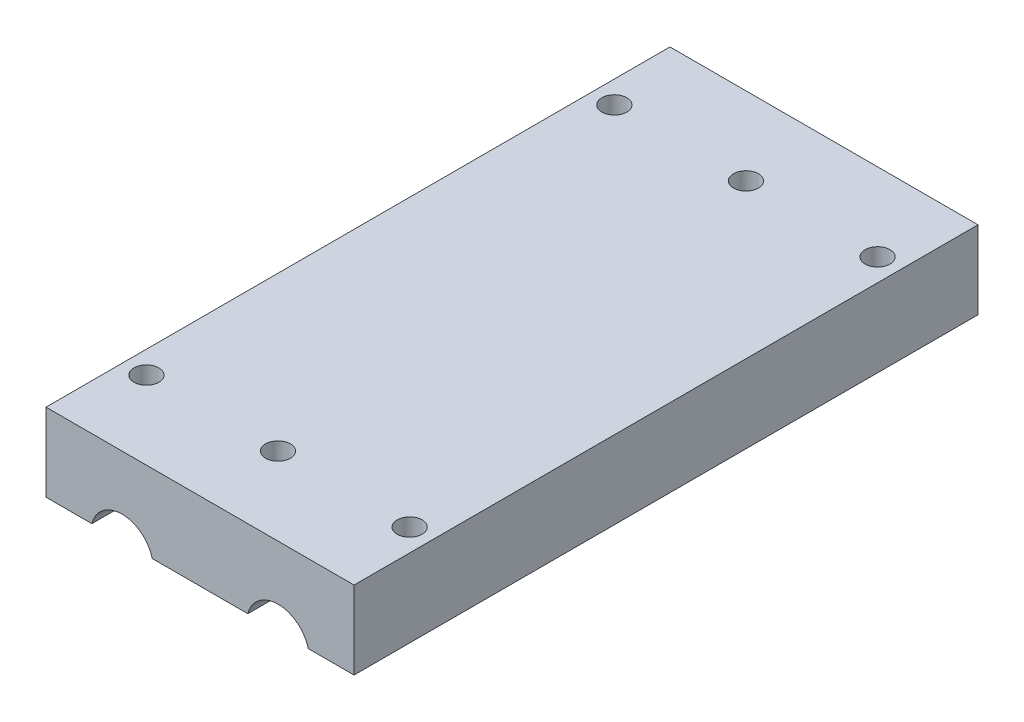
ISO-10303-21;
HEADER;
FILE_DESCRIPTION(('STEP AP214'),'2;1');
FILE_NAME('part.step','',(''),(''),'','','');
FILE_SCHEMA(('AUTOMOTIVE_DESIGN { 1 0 10303 214 1 1 1 1 }'));
ENDSEC;
DATA;
#1=APPLICATION_CONTEXT('core data for automotive mechanical design processes');
#2=APPLICATION_PROTOCOL_DEFINITION('international standard','automotive_design',2000,#1);
#3=PRODUCT_CONTEXT('',#1,'mechanical');
#4=PRODUCT('Part','Part','',(#3));
#5=PRODUCT_RELATED_PRODUCT_CATEGORY('part','',(#4));
#6=PRODUCT_DEFINITION_FORMATION('','',#4);
#7=PRODUCT_DEFINITION_CONTEXT('part definition',#1,'design');
#8=PRODUCT_DEFINITION('design','',#6,#7);
#9=PRODUCT_DEFINITION_SHAPE('','',#8);
#10=(LENGTH_UNIT() NAMED_UNIT(*) SI_UNIT(.MILLI.,.METRE.));
#11=(NAMED_UNIT(*) PLANE_ANGLE_UNIT() SI_UNIT($,.RADIAN.));
#12=(NAMED_UNIT(*) SI_UNIT($,.STERADIAN.) SOLID_ANGLE_UNIT());
#13=UNCERTAINTY_MEASURE_WITH_UNIT(LENGTH_MEASURE(1.E-05),#10,'distance_accuracy_value','');
#14=(GEOMETRIC_REPRESENTATION_CONTEXT(3) GLOBAL_UNCERTAINTY_ASSIGNED_CONTEXT((#13)) GLOBAL_UNIT_ASSIGNED_CONTEXT((#10,
#11,#12)) REPRESENTATION_CONTEXT('',''));
#15=CARTESIAN_POINT('',(0.,0.,0.));
#16=DIRECTION('',(0.,0.,1.));
#17=DIRECTION('',(1.,0.,0.));
#18=AXIS2_PLACEMENT_3D('',#15,#16,#17);
#19=CARTESIAN_POINT('',(0.,0.,0.));
#20=DIRECTION('',(0.,-1.,0.));
#21=DIRECTION('',(0.,0.,-1.));
#22=AXIS2_PLACEMENT_3D('',#19,#20,#21);
#23=PLANE('',#22);
#24=CARTESIAN_POINT('',(0.,0.,-30.));
#25=DIRECTION('',(0.,-1.,0.));
#26=DIRECTION('',(0.,0.,-1.));
#27=AXIS2_PLACEMENT_3D('',#24,#25,#26);
#28=CIRCLE('',#27,1.6);
#29=CARTESIAN_POINT('',(0.,0.,-31.6));
#30=VERTEX_POINT('',#29);
#31=EDGE_CURVE('E124',#30,#30,#28,.T.);
#32=ORIENTED_EDGE('',*,*,#31,.F.);
#33=EDGE_LOOP('',(#32));
#34=FACE_BOUND('',#33,.T.);
#35=CARTESIAN_POINT('',(0.,0.,30.));
#36=DIRECTION('',(0.,-1.,0.));
#37=DIRECTION('',(0.,0.,-1.));
#38=AXIS2_PLACEMENT_3D('',#35,#36,#37);
#39=CIRCLE('',#38,1.6);
#40=CARTESIAN_POINT('',(0.,0.,28.4));
#41=VERTEX_POINT('',#40);
#42=EDGE_CURVE('E219',#41,#41,#39,.T.);
#43=ORIENTED_EDGE('',*,*,#42,.F.);
#44=EDGE_LOOP('',(#43));
#45=FACE_BOUND('',#44,.T.);
#46=DIRECTION('',(0.,0.,1.));
#47=VECTOR('',#46,1.);
#48=CARTESIAN_POINT('',(-6.12701665379258,0.,-42.));
#49=LINE('',#48,#47);
#50=CARTESIAN_POINT('',(-6.12701665379258,0.,-40.));
#51=VERTEX_POINT('',#50);
#52=CARTESIAN_POINT('',(-6.12701665379258,0.,40.));
#53=VERTEX_POINT('',#52);
#54=EDGE_CURVE('E11',#51,#53,#49,.T.);
#55=ORIENTED_EDGE('',*,*,#54,.F.);
#56=DIRECTION('',(-1.,0.,0.));
#57=VECTOR('',#56,1.);
#58=CARTESIAN_POINT('',(-19.75,0.,-40.));
#59=LINE('',#58,#57);
#60=CARTESIAN_POINT('',(6.12701665379258,0.,-40.));
#61=VERTEX_POINT('',#60);
#62=EDGE_CURVE('E167',#61,#51,#59,.T.);
#63=ORIENTED_EDGE('',*,*,#62,.F.);
#64=DIRECTION('',(0.,0.,1.));
#65=VECTOR('',#64,1.);
#66=CARTESIAN_POINT('',(6.12701665379258,0.,-42.));
#67=LINE('',#66,#65);
#68=CARTESIAN_POINT('',(6.12701665379258,0.,40.));
#69=VERTEX_POINT('',#68);
#70=EDGE_CURVE('E112',#69,#61,#67,.F.);
#71=ORIENTED_EDGE('',*,*,#70,.F.);
#72=DIRECTION('',(1.,0.,0.));
#73=VECTOR('',#72,1.);
#74=CARTESIAN_POINT('',(-19.75,0.,40.));
#75=LINE('',#74,#73);
#76=EDGE_CURVE('E122',#53,#69,#75,.T.);
#77=ORIENTED_EDGE('',*,*,#76,.F.);
#78=EDGE_LOOP('',(#55,#63,#71,#77));
#79=FACE_BOUND('',#78,.T.);
#80=ADVANCED_FACE('F39',(#34,#45,#79),#23,.T.);
#81=CARTESIAN_POINT('',(16.875,0.,-30.));
#82=DIRECTION('',(0.,-1.,0.));
#83=DIRECTION('',(0.,0.,-1.));
#84=AXIS2_PLACEMENT_3D('',#81,#82,#83);
#85=CIRCLE('',#84,1.6);
#86=CARTESIAN_POINT('',(16.875,0.,-31.6));
#87=VERTEX_POINT('',#86);
#88=EDGE_CURVE('E223',#87,#87,#85,.T.);
#89=ORIENTED_EDGE('',*,*,#88,.F.);
#90=EDGE_LOOP('',(#89));
#91=FACE_BOUND('',#90,.T.);
#92=CARTESIAN_POINT('',(16.875,0.,30.));
#93=DIRECTION('',(0.,-1.,0.));
#94=DIRECTION('',(0.,0.,-1.));
#95=AXIS2_PLACEMENT_3D('',#92,#93,#94);
#96=CIRCLE('',#95,1.6);
#97=CARTESIAN_POINT('',(16.875,0.,28.4));
#98=VERTEX_POINT('',#97);
#99=EDGE_CURVE('E202',#98,#98,#96,.T.);
#100=ORIENTED_EDGE('',*,*,#99,.F.);
#101=EDGE_LOOP('',(#100));
#102=FACE_BOUND('',#101,.T.);
#103=DIRECTION('',(0.,0.,1.));
#104=VECTOR('',#103,1.);
#105=CARTESIAN_POINT('',(13.8729833462074,0.,-42.));
#106=LINE('',#105,#104);
#107=CARTESIAN_POINT('',(13.8729833462074,0.,-40.));
#108=VERTEX_POINT('',#107);
#109=CARTESIAN_POINT('',(13.8729833462074,0.,40.));
#110=VERTEX_POINT('',#109);
#111=EDGE_CURVE('E104',#108,#110,#106,.T.);
#112=ORIENTED_EDGE('',*,*,#111,.F.);
#113=CARTESIAN_POINT('',(19.75,0.,-40.));
#114=VERTEX_POINT('',#113);
#115=EDGE_CURVE('E136',#114,#108,#59,.T.);
#116=ORIENTED_EDGE('',*,*,#115,.F.);
#117=DIRECTION('',(0.,0.,-1.));
#118=VECTOR('',#117,1.);
#119=CARTESIAN_POINT('',(19.75,0.,40.));
#120=LINE('',#119,#118);
#121=CARTESIAN_POINT('',(19.75,0.,40.));
#122=VERTEX_POINT('',#121);
#123=EDGE_CURVE('E129',#122,#114,#120,.T.);
#124=ORIENTED_EDGE('',*,*,#123,.F.);
#125=EDGE_CURVE('E119',#110,#122,#75,.T.);
#126=ORIENTED_EDGE('',*,*,#125,.F.);
#127=EDGE_LOOP('',(#112,#116,#124,#126));
#128=FACE_BOUND('',#127,.T.);
#129=ADVANCED_FACE('F127',(#91,#102,#128),#23,.T.);
#130=CARTESIAN_POINT('',(19.75,10.,40.));
#131=DIRECTION('',(-1.,0.,0.));
#132=DIRECTION('',(0.,0.,1.));
#133=AXIS2_PLACEMENT_3D('',#130,#131,#132);
#134=PLANE('',#133);
#135=ORIENTED_EDGE('',*,*,#123,.T.);
#136=DIRECTION('',(0.,-1.,0.));
#137=VECTOR('',#136,1.);
#138=CARTESIAN_POINT('',(19.75,10.,-40.));
#139=LINE('',#138,#137);
#140=CARTESIAN_POINT('',(19.75,10.,-40.));
#141=VERTEX_POINT('',#140);
#142=EDGE_CURVE('E186',#141,#114,#139,.T.);
#143=ORIENTED_EDGE('',*,*,#142,.F.);
#144=DIRECTION('',(0.,0.,-1.));
#145=VECTOR('',#144,1.);
#146=CARTESIAN_POINT('',(19.75,10.,40.));
#147=LINE('',#146,#145);
#148=CARTESIAN_POINT('',(19.75,10.,40.));
#149=VERTEX_POINT('',#148);
#150=EDGE_CURVE('E140',#149,#141,#147,.T.);
#151=ORIENTED_EDGE('',*,*,#150,.F.);
#152=DIRECTION('',(0.,-1.,0.));
#153=VECTOR('',#152,1.);
#154=CARTESIAN_POINT('',(19.75,10.,40.));
#155=LINE('',#154,#153);
#156=EDGE_CURVE('E162',#149,#122,#155,.T.);
#157=ORIENTED_EDGE('',*,*,#156,.T.);
#158=EDGE_LOOP('',(#135,#143,#151,#157));
#159=FACE_BOUND('',#158,.T.);
#160=ADVANCED_FACE('F41',(#159),#134,.F.);
#161=CARTESIAN_POINT('',(-19.75,10.,-40.));
#162=DIRECTION('',(0.,0.,1.));
#163=DIRECTION('',(1.,0.,0.));
#164=AXIS2_PLACEMENT_3D('',#161,#162,#163);
#165=PLANE('',#164);
#166=ORIENTED_EDGE('',*,*,#62,.T.);
#167=CARTESIAN_POINT('',(-10.,-0.999999999999999,-40.));
#168=DIRECTION('',(0.,0.,1.));
#169=DIRECTION('',(1.,0.,0.));
#170=AXIS2_PLACEMENT_3D('',#167,#168,#169);
#171=CIRCLE('',#170,4.);
#172=CARTESIAN_POINT('',(-13.8729833462074,0.,-40.));
#173=VERTEX_POINT('',#172);
#174=EDGE_CURVE('E154',#51,#173,#171,.T.);
#175=ORIENTED_EDGE('',*,*,#174,.T.);
#176=CARTESIAN_POINT('',(-19.75,0.,-40.));
#177=VERTEX_POINT('',#176);
#178=EDGE_CURVE('E165',#173,#177,#59,.T.);
#179=ORIENTED_EDGE('',*,*,#178,.T.);
#180=DIRECTION('',(0.,-1.,0.));
#181=VECTOR('',#180,1.);
#182=CARTESIAN_POINT('',(-19.75,10.,-40.));
#183=LINE('',#182,#181);
#184=CARTESIAN_POINT('',(-19.75,10.,-40.));
#185=VERTEX_POINT('',#184);
#186=EDGE_CURVE('E178',#185,#177,#183,.T.);
#187=ORIENTED_EDGE('',*,*,#186,.F.);
#188=DIRECTION('',(-1.,0.,0.));
#189=VECTOR('',#188,1.);
#190=CARTESIAN_POINT('',(-19.75,10.,-40.));
#191=LINE('',#190,#189);
#192=EDGE_CURVE('E145',#141,#185,#191,.T.);
#193=ORIENTED_EDGE('',*,*,#192,.F.);
#194=ORIENTED_EDGE('',*,*,#142,.T.);
#195=ORIENTED_EDGE('',*,*,#115,.T.);
#196=CARTESIAN_POINT('',(10.,-0.999999999999999,-40.));
#197=DIRECTION('',(0.,0.,1.));
#198=DIRECTION('',(1.,0.,0.));
#199=AXIS2_PLACEMENT_3D('',#196,#197,#198);
#200=CIRCLE('',#199,4.);
#201=EDGE_CURVE('E107',#108,#61,#200,.T.);
#202=ORIENTED_EDGE('',*,*,#201,.T.);
#203=EDGE_LOOP('',(#166,#175,#179,#187,#193,#194,#195,#202));
#204=FACE_BOUND('',#203,.T.);
#205=ADVANCED_FACE('F177',(#204),#165,.F.);
#206=CARTESIAN_POINT('',(-19.75,10.,40.));
#207=DIRECTION('',(1.,0.,0.));
#208=DIRECTION('',(0.,0.,-1.));
#209=AXIS2_PLACEMENT_3D('',#206,#207,#208);
#210=PLANE('',#209);
#211=DIRECTION('',(0.,0.,1.));
#212=VECTOR('',#211,1.);
#213=CARTESIAN_POINT('',(-19.75,0.,40.));
#214=LINE('',#213,#212);
#215=CARTESIAN_POINT('',(-19.75,0.,40.));
#216=VERTEX_POINT('',#215);
#217=EDGE_CURVE('E131',#177,#216,#214,.T.);
#218=ORIENTED_EDGE('',*,*,#217,.T.);
#219=DIRECTION('',(0.,-1.,0.));
#220=VECTOR('',#219,1.);
#221=CARTESIAN_POINT('',(-19.75,10.,40.));
#222=LINE('',#221,#220);
#223=CARTESIAN_POINT('',(-19.75,10.,40.));
#224=VERTEX_POINT('',#223);
#225=EDGE_CURVE('E187',#224,#216,#222,.T.);
#226=ORIENTED_EDGE('',*,*,#225,.F.);
#227=DIRECTION('',(0.,0.,1.));
#228=VECTOR('',#227,1.);
#229=CARTESIAN_POINT('',(-19.75,10.,40.));
#230=LINE('',#229,#228);
#231=EDGE_CURVE('E151',#185,#224,#230,.T.);
#232=ORIENTED_EDGE('',*,*,#231,.F.);
#233=ORIENTED_EDGE('',*,*,#186,.T.);
#234=EDGE_LOOP('',(#218,#226,#232,#233));
#235=FACE_BOUND('',#234,.T.);
#236=ADVANCED_FACE('F183',(#235),#210,.F.);
#237=CARTESIAN_POINT('',(-19.75,10.,40.));
#238=DIRECTION('',(0.,0.,-1.));
#239=DIRECTION('',(-1.,0.,0.));
#240=AXIS2_PLACEMENT_3D('',#237,#238,#239);
#241=PLANE('',#240);
#242=CARTESIAN_POINT('',(-13.8729833462074,0.,40.));
#243=VERTEX_POINT('',#242);
#244=EDGE_CURVE('E133',#216,#243,#75,.T.);
#245=ORIENTED_EDGE('',*,*,#244,.T.);
#246=CARTESIAN_POINT('',(-10.,-0.999999999999999,40.));
#247=DIRECTION('',(0.,0.,1.));
#248=DIRECTION('',(1.,0.,0.));
#249=AXIS2_PLACEMENT_3D('',#246,#247,#248);
#250=CIRCLE('',#249,4.);
#251=EDGE_CURVE('E64',#53,#243,#250,.T.);
#252=ORIENTED_EDGE('',*,*,#251,.F.);
#253=ORIENTED_EDGE('',*,*,#76,.T.);
#254=CARTESIAN_POINT('',(10.,-0.999999999999999,40.));
#255=DIRECTION('',(0.,0.,1.));
#256=DIRECTION('',(1.,0.,0.));
#257=AXIS2_PLACEMENT_3D('',#254,#255,#256);
#258=CIRCLE('',#257,4.);
#259=EDGE_CURVE('E57',#110,#69,#258,.T.);
#260=ORIENTED_EDGE('',*,*,#259,.F.);
#261=ORIENTED_EDGE('',*,*,#125,.T.);
#262=ORIENTED_EDGE('',*,*,#156,.F.);
#263=DIRECTION('',(1.,0.,0.));
#264=VECTOR('',#263,1.);
#265=CARTESIAN_POINT('',(-19.75,10.,40.));
#266=LINE('',#265,#264);
#267=EDGE_CURVE('E159',#224,#149,#266,.T.);
#268=ORIENTED_EDGE('',*,*,#267,.F.);
#269=ORIENTED_EDGE('',*,*,#225,.T.);
#270=EDGE_LOOP('',(#245,#252,#253,#260,#261,#262,#268,#269));
#271=FACE_BOUND('',#270,.T.);
#272=ADVANCED_FACE('F117',(#271),#241,.F.);
#273=CARTESIAN_POINT('',(0.,10.,0.));
#274=DIRECTION('',(0.,-1.,0.));
#275=DIRECTION('',(0.,0.,-1.));
#276=AXIS2_PLACEMENT_3D('',#273,#274,#275);
#277=PLANE('',#276);
#278=CARTESIAN_POINT('',(0.,10.,-30.));
#279=DIRECTION('',(0.,1.,0.));
#280=DIRECTION('',(0.,0.,1.));
#281=AXIS2_PLACEMENT_3D('',#278,#279,#280);
#282=CIRCLE('',#281,1.6);
#283=CARTESIAN_POINT('',(0.,10.,-28.4));
#284=VERTEX_POINT('',#283);
#285=EDGE_CURVE('E204',#284,#284,#282,.T.);
#286=ORIENTED_EDGE('',*,*,#285,.F.);
#287=EDGE_LOOP('',(#286));
#288=FACE_BOUND('',#287,.T.);
#289=CARTESIAN_POINT('',(16.875,10.,-30.));
#290=DIRECTION('',(0.,1.,0.));
#291=DIRECTION('',(0.,0.,1.));
#292=AXIS2_PLACEMENT_3D('',#289,#290,#291);
#293=CIRCLE('',#292,1.6);
#294=CARTESIAN_POINT('',(16.875,10.,-28.4));
#295=VERTEX_POINT('',#294);
#296=EDGE_CURVE('E210',#295,#295,#293,.T.);
#297=ORIENTED_EDGE('',*,*,#296,.F.);
#298=EDGE_LOOP('',(#297));
#299=FACE_BOUND('',#298,.T.);
#300=CARTESIAN_POINT('',(-16.875,10.,30.));
#301=DIRECTION('',(0.,1.,0.));
#302=DIRECTION('',(0.,0.,1.));
#303=AXIS2_PLACEMENT_3D('',#300,#301,#302);
#304=CIRCLE('',#303,1.6);
#305=CARTESIAN_POINT('',(-16.875,10.,31.6));
#306=VERTEX_POINT('',#305);
#307=EDGE_CURVE('E274',#306,#306,#304,.T.);
#308=ORIENTED_EDGE('',*,*,#307,.F.);
#309=EDGE_LOOP('',(#308));
#310=FACE_BOUND('',#309,.T.);
#311=CARTESIAN_POINT('',(0.,10.,30.));
#312=DIRECTION('',(0.,1.,0.));
#313=DIRECTION('',(0.,0.,1.));
#314=AXIS2_PLACEMENT_3D('',#311,#312,#313);
#315=CIRCLE('',#314,1.6);
#316=CARTESIAN_POINT('',(0.,10.,31.6));
#317=VERTEX_POINT('',#316);
#318=EDGE_CURVE('E214',#317,#317,#315,.T.);
#319=ORIENTED_EDGE('',*,*,#318,.F.);
#320=EDGE_LOOP('',(#319));
#321=FACE_BOUND('',#320,.T.);
#322=CARTESIAN_POINT('',(16.875,10.,30.));
#323=DIRECTION('',(0.,1.,0.));
#324=DIRECTION('',(0.,0.,1.));
#325=AXIS2_PLACEMENT_3D('',#322,#323,#324);
#326=CIRCLE('',#325,1.6);
#327=CARTESIAN_POINT('',(16.875,10.,31.6));
#328=VERTEX_POINT('',#327);
#329=EDGE_CURVE('E282',#328,#328,#326,.T.);
#330=ORIENTED_EDGE('',*,*,#329,.F.);
#331=EDGE_LOOP('',(#330));
#332=FACE_BOUND('',#331,.T.);
#333=CARTESIAN_POINT('',(-16.875,10.,-30.));
#334=DIRECTION('',(0.,1.,0.));
#335=DIRECTION('',(0.,0.,1.));
#336=AXIS2_PLACEMENT_3D('',#333,#334,#335);
#337=CIRCLE('',#336,1.6);
#338=CARTESIAN_POINT('',(-16.875,10.,-28.4));
#339=VERTEX_POINT('',#338);
#340=EDGE_CURVE('E196',#339,#339,#337,.T.);
#341=ORIENTED_EDGE('',*,*,#340,.F.);
#342=EDGE_LOOP('',(#341));
#343=FACE_BOUND('',#342,.T.);
#344=ORIENTED_EDGE('',*,*,#150,.T.);
#345=ORIENTED_EDGE('',*,*,#192,.T.);
#346=ORIENTED_EDGE('',*,*,#231,.T.);
#347=ORIENTED_EDGE('',*,*,#267,.T.);
#348=EDGE_LOOP('',(#344,#345,#346,#347));
#349=FACE_BOUND('',#348,.T.);
#350=ADVANCED_FACE('F259',(#288,#299,#310,#321,#332,#343,#349),#277,.F.);
#351=CARTESIAN_POINT('',(-16.875,0.,30.));
#352=DIRECTION('',(0.,-1.,0.));
#353=DIRECTION('',(0.,0.,-1.));
#354=AXIS2_PLACEMENT_3D('',#351,#352,#353);
#355=CIRCLE('',#354,1.6);
#356=CARTESIAN_POINT('',(-16.875,0.,28.4));
#357=VERTEX_POINT('',#356);
#358=EDGE_CURVE('E43',#357,#357,#355,.T.);
#359=ORIENTED_EDGE('',*,*,#358,.F.);
#360=EDGE_LOOP('',(#359));
#361=FACE_BOUND('',#360,.T.);
#362=CARTESIAN_POINT('',(-16.875,0.,-30.));
#363=DIRECTION('',(0.,-1.,0.));
#364=DIRECTION('',(0.,0.,-1.));
#365=AXIS2_PLACEMENT_3D('',#362,#363,#364);
#366=CIRCLE('',#365,1.6);
#367=CARTESIAN_POINT('',(-16.875,0.,-31.6));
#368=VERTEX_POINT('',#367);
#369=EDGE_CURVE('E193',#368,#368,#366,.T.);
#370=ORIENTED_EDGE('',*,*,#369,.F.);
#371=EDGE_LOOP('',(#370));
#372=FACE_BOUND('',#371,.T.);
#373=DIRECTION('',(0.,0.,1.));
#374=VECTOR('',#373,1.);
#375=CARTESIAN_POINT('',(-13.8729833462074,0.,-42.));
#376=LINE('',#375,#374);
#377=EDGE_CURVE('E49',#243,#173,#376,.F.);
#378=ORIENTED_EDGE('',*,*,#377,.F.);
#379=ORIENTED_EDGE('',*,*,#244,.F.);
#380=ORIENTED_EDGE('',*,*,#217,.F.);
#381=ORIENTED_EDGE('',*,*,#178,.F.);
#382=EDGE_LOOP('',(#378,#379,#380,#381));
#383=FACE_BOUND('',#382,.T.);
#384=ADVANCED_FACE('F189',(#361,#372,#383),#23,.T.);
#385=CARTESIAN_POINT('',(10.,-0.999999999999999,-42.));
#386=DIRECTION('',(0.,0.,1.));
#387=DIRECTION('',(1.,0.,0.));
#388=AXIS2_PLACEMENT_3D('',#385,#386,#387);
#389=CYLINDRICAL_SURFACE('',#388,4.);
#390=ORIENTED_EDGE('',*,*,#111,.T.);
#391=ORIENTED_EDGE('',*,*,#259,.T.);
#392=ORIENTED_EDGE('',*,*,#70,.T.);
#393=ORIENTED_EDGE('',*,*,#201,.F.);
#394=EDGE_LOOP('',(#390,#391,#392,#393));
#395=FACE_BOUND('',#394,.T.);
#396=ADVANCED_FACE('F105',(#395),#389,.F.);
#397=CARTESIAN_POINT('',(-10.,-0.999999999999999,-42.));
#398=DIRECTION('',(0.,0.,1.));
#399=DIRECTION('',(1.,0.,0.));
#400=AXIS2_PLACEMENT_3D('',#397,#398,#399);
#401=CYLINDRICAL_SURFACE('',#400,4.);
#402=ORIENTED_EDGE('',*,*,#54,.T.);
#403=ORIENTED_EDGE('',*,*,#251,.T.);
#404=ORIENTED_EDGE('',*,*,#377,.T.);
#405=ORIENTED_EDGE('',*,*,#174,.F.);
#406=EDGE_LOOP('',(#402,#403,#404,#405));
#407=FACE_BOUND('',#406,.T.);
#408=ADVANCED_FACE('F236',(#407),#401,.F.);
#409=CARTESIAN_POINT('',(-16.875,-0.999999999999996,-30.));
#410=DIRECTION('',(0.,1.,0.));
#411=DIRECTION('',(0.,0.,1.));
#412=AXIS2_PLACEMENT_3D('',#409,#410,#411);
#413=CYLINDRICAL_SURFACE('',#412,1.6);
#414=ORIENTED_EDGE('',*,*,#369,.T.);
#415=EDGE_LOOP('',(#414));
#416=FACE_BOUND('',#415,.T.);
#417=ORIENTED_EDGE('',*,*,#340,.T.);
#418=EDGE_LOOP('',(#417));
#419=FACE_BOUND('',#418,.T.);
#420=ADVANCED_FACE('F238',(#416,#419),#413,.F.);
#421=CARTESIAN_POINT('',(-16.875,-0.999999999999996,30.));
#422=DIRECTION('',(0.,1.,0.));
#423=DIRECTION('',(0.,0.,1.));
#424=AXIS2_PLACEMENT_3D('',#421,#422,#423);
#425=CYLINDRICAL_SURFACE('',#424,1.6);
#426=ORIENTED_EDGE('',*,*,#358,.T.);
#427=EDGE_LOOP('',(#426));
#428=FACE_BOUND('',#427,.T.);
#429=ORIENTED_EDGE('',*,*,#307,.T.);
#430=EDGE_LOOP('',(#429));
#431=FACE_BOUND('',#430,.T.);
#432=ADVANCED_FACE('F244',(#428,#431),#425,.F.);
#433=CARTESIAN_POINT('',(16.875,-0.999999999999996,30.));
#434=DIRECTION('',(0.,1.,0.));
#435=DIRECTION('',(0.,0.,1.));
#436=AXIS2_PLACEMENT_3D('',#433,#434,#435);
#437=CYLINDRICAL_SURFACE('',#436,1.6);
#438=ORIENTED_EDGE('',*,*,#99,.T.);
#439=EDGE_LOOP('',(#438));
#440=FACE_BOUND('',#439,.T.);
#441=ORIENTED_EDGE('',*,*,#329,.T.);
#442=EDGE_LOOP('',(#441));
#443=FACE_BOUND('',#442,.T.);
#444=ADVANCED_FACE('F270',(#440,#443),#437,.F.);
#445=CARTESIAN_POINT('',(0.,-0.999999999999996,30.));
#446=DIRECTION('',(0.,1.,0.));
#447=DIRECTION('',(0.,0.,1.));
#448=AXIS2_PLACEMENT_3D('',#445,#446,#447);
#449=CYLINDRICAL_SURFACE('',#448,1.6);
#450=ORIENTED_EDGE('',*,*,#42,.T.);
#451=EDGE_LOOP('',(#450));
#452=FACE_BOUND('',#451,.T.);
#453=ORIENTED_EDGE('',*,*,#318,.T.);
#454=EDGE_LOOP('',(#453));
#455=FACE_BOUND('',#454,.T.);
#456=ADVANCED_FACE('F291',(#452,#455),#449,.F.);
#457=CARTESIAN_POINT('',(16.875,-0.999999999999996,-30.));
#458=DIRECTION('',(0.,1.,0.));
#459=DIRECTION('',(0.,0.,1.));
#460=AXIS2_PLACEMENT_3D('',#457,#458,#459);
#461=CYLINDRICAL_SURFACE('',#460,1.6);
#462=ORIENTED_EDGE('',*,*,#88,.T.);
#463=EDGE_LOOP('',(#462));
#464=FACE_BOUND('',#463,.T.);
#465=ORIENTED_EDGE('',*,*,#296,.T.);
#466=EDGE_LOOP('',(#465));
#467=FACE_BOUND('',#466,.T.);
#468=ADVANCED_FACE('F297',(#464,#467),#461,.F.);
#469=CARTESIAN_POINT('',(0.,-0.999999999999996,-30.));
#470=DIRECTION('',(0.,1.,0.));
#471=DIRECTION('',(0.,0.,1.));
#472=AXIS2_PLACEMENT_3D('',#469,#470,#471);
#473=CYLINDRICAL_SURFACE('',#472,1.6);
#474=ORIENTED_EDGE('',*,*,#31,.T.);
#475=EDGE_LOOP('',(#474));
#476=FACE_BOUND('',#475,.T.);
#477=ORIENTED_EDGE('',*,*,#285,.T.);
#478=EDGE_LOOP('',(#477));
#479=FACE_BOUND('',#478,.T.);
#480=ADVANCED_FACE('F301',(#476,#479),#473,.F.);
#481=CLOSED_SHELL('',(#80,#129,#160,#205,#236,#272,#350,#384,#396,#408,#420,#432,#444,#456,#468,#480));
#482=MANIFOLD_SOLID_BREP('B2',#481);
#483=ADVANCED_BREP_SHAPE_REPRESENTATION('',(#18,#482),#14);
#484=SHAPE_DEFINITION_REPRESENTATION(#9,#483);
ENDSEC;
END-ISO-10303-21;
